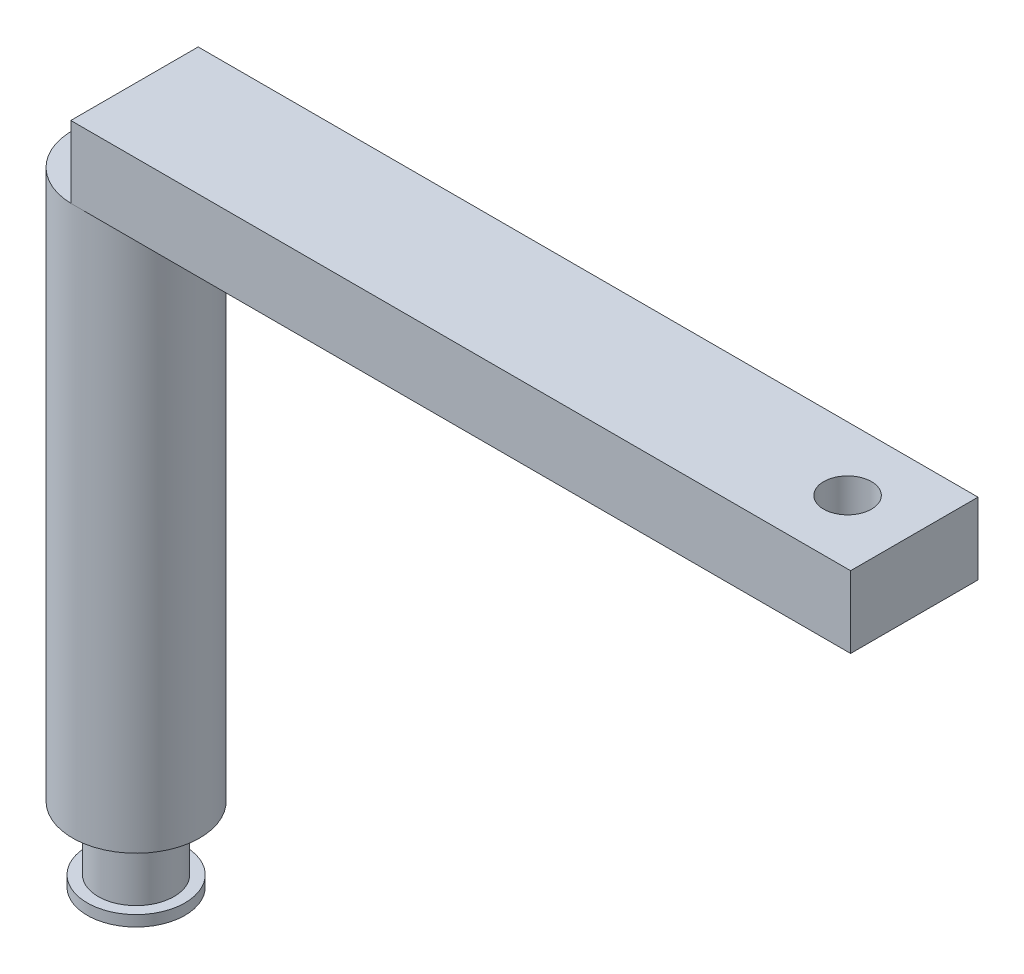
ISO-10303-21;
HEADER;
FILE_DESCRIPTION(('STEP AP214'),'2;1');
FILE_NAME('part.step','',(''),(''),'','','');
FILE_SCHEMA(('AUTOMOTIVE_DESIGN { 1 0 10303 214 1 1 1 1 }'));
ENDSEC;
DATA;
#1=APPLICATION_CONTEXT('core data for automotive mechanical design processes');
#2=APPLICATION_PROTOCOL_DEFINITION('international standard','automotive_design',2000,#1);
#3=PRODUCT_CONTEXT('',#1,'mechanical');
#4=PRODUCT('Part','Part','',(#3));
#5=PRODUCT_RELATED_PRODUCT_CATEGORY('part','',(#4));
#6=PRODUCT_DEFINITION_FORMATION('','',#4);
#7=PRODUCT_DEFINITION_CONTEXT('part definition',#1,'design');
#8=PRODUCT_DEFINITION('design','',#6,#7);
#9=PRODUCT_DEFINITION_SHAPE('','',#8);
#10=(LENGTH_UNIT() NAMED_UNIT(*) SI_UNIT(.MILLI.,.METRE.));
#11=(NAMED_UNIT(*) PLANE_ANGLE_UNIT() SI_UNIT($,.RADIAN.));
#12=(NAMED_UNIT(*) SI_UNIT($,.STERADIAN.) SOLID_ANGLE_UNIT());
#13=UNCERTAINTY_MEASURE_WITH_UNIT(LENGTH_MEASURE(1.E-05),#10,'distance_accuracy_value','');
#14=(GEOMETRIC_REPRESENTATION_CONTEXT(3) GLOBAL_UNCERTAINTY_ASSIGNED_CONTEXT((#13)) GLOBAL_UNIT_ASSIGNED_CONTEXT((#10,
#11,#12)) REPRESENTATION_CONTEXT('',''));
#15=CARTESIAN_POINT('',(0.,0.,0.));
#16=DIRECTION('',(0.,0.,1.));
#17=DIRECTION('',(1.,0.,0.));
#18=AXIS2_PLACEMENT_3D('',#15,#16,#17);
#19=CARTESIAN_POINT('',(-14.791284368385,30.2308686376491,35.0998270024249));
#20=DIRECTION('',(0.,-1.,0.));
#21=DIRECTION('',(0.,0.,-1.));
#22=AXIS2_PLACEMENT_3D('',#19,#20,#21);
#23=PLANE('',#22);
#24=DIRECTION('',(0.,0.,1.));
#25=VECTOR('',#24,1.);
#26=CARTESIAN_POINT('',(-14.7912843683849,30.2308686376491,32.4351305132776));
#27=LINE('',#26,#25);
#28=CARTESIAN_POINT('',(-14.7912843683849,30.2308686376491,32.4351305132776));
#29=VERTEX_POINT('',#28);
#30=CARTESIAN_POINT('',(-14.7912843683877,30.2308686376491,35.0998270024248));
#31=VERTEX_POINT('',#30);
#32=EDGE_CURVE('E50',#29,#31,#27,.T.);
#33=ORIENTED_EDGE('',*,*,#32,.F.);
#34=CARTESIAN_POINT('',(-14.7575347161689,30.2308686376491,33.7674787578511));
#35=DIRECTION('',(0.,-1.,0.));
#36=DIRECTION('',(0.,0.,-1.));
#37=AXIS2_PLACEMENT_3D('',#34,#35,#36);
#38=CIRCLE('',#37,1.33277563147122);
#39=EDGE_CURVE('E129',#31,#29,#38,.T.);
#40=ORIENTED_EDGE('',*,*,#39,.F.);
#41=EDGE_LOOP('',(#33,#40));
#42=FACE_BOUND('',#41,.T.);
#43=ADVANCED_FACE('F33',(#42),#23,.F.);
#44=CARTESIAN_POINT('',(-14.7776347133582,17.4184959349028,34.5609742226226));
#45=DIRECTION('',(0.,-1.,0.));
#46=DIRECTION('',(0.,0.,-1.));
#47=AXIS2_PLACEMENT_3D('',#44,#45,#46);
#48=PLANE('',#47);
#49=CARTESIAN_POINT('',(-14.7575347161689,17.4184959349028,33.7674787578511));
#50=DIRECTION('',(0.,-1.,0.));
#51=DIRECTION('',(0.,0.,-1.));
#52=AXIS2_PLACEMENT_3D('',#49,#50,#51);
#53=CIRCLE('',#52,1.02270497584844);
#54=CARTESIAN_POINT('',(-14.7575347161689,17.4184959349028,32.7447737820027));
#55=VERTEX_POINT('',#54);
#56=EDGE_CURVE('E11',#55,#55,#53,.T.);
#57=ORIENTED_EDGE('',*,*,#56,.F.);
#58=EDGE_LOOP('',(#57));
#59=FACE_BOUND('',#58,.T.);
#60=CARTESIAN_POINT('',(-14.7575347161689,17.4184959349028,33.7674787578511));
#61=DIRECTION('',(0.,-1.,0.));
#62=DIRECTION('',(0.,0.,-1.));
#63=AXIS2_PLACEMENT_3D('',#60,#61,#62);
#64=CIRCLE('',#63,0.793749999999999);
#65=CARTESIAN_POINT('',(-14.7575347161689,17.4184959349028,32.9737287578511));
#66=VERTEX_POINT('',#65);
#67=EDGE_CURVE('E105',#66,#66,#64,.T.);
#68=ORIENTED_EDGE('',*,*,#67,.T.);
#69=EDGE_LOOP('',(#68));
#70=FACE_BOUND('',#69,.T.);
#71=ADVANCED_FACE('F35',(#59,#70),#48,.F.);
#72=CARTESIAN_POINT('',(-14.7575347161689,30.3884889174142,33.7674787578511));
#73=DIRECTION('',(0.,-1.,0.));
#74=DIRECTION('',(0.,0.,-1.));
#75=AXIS2_PLACEMENT_3D('',#72,#73,#74);
#76=CYLINDRICAL_SURFACE('',#75,1.02270497584844);
#77=CARTESIAN_POINT('',(-14.7575347161689,17.1921491728471,33.7674787578511));
#78=DIRECTION('',(0.,-1.,0.));
#79=DIRECTION('',(0.,0.,-1.));
#80=AXIS2_PLACEMENT_3D('',#77,#78,#79);
#81=CIRCLE('',#80,1.02270497584844);
#82=CARTESIAN_POINT('',(-14.7575347161689,17.1921491728471,32.7447737820027));
#83=VERTEX_POINT('',#82);
#84=EDGE_CURVE('E42',#83,#83,#81,.T.);
#85=ORIENTED_EDGE('',*,*,#84,.F.);
#86=EDGE_LOOP('',(#85));
#87=FACE_BOUND('',#86,.T.);
#88=ORIENTED_EDGE('',*,*,#56,.T.);
#89=EDGE_LOOP('',(#88));
#90=FACE_BOUND('',#89,.T.);
#91=ADVANCED_FACE('F174',(#87,#90),#76,.T.);
#92=CARTESIAN_POINT('',(-14.7834325015421,17.1921491728471,34.7898557784936));
#93=DIRECTION('',(0.,1.,0.));
#94=DIRECTION('',(0.,0.,1.));
#95=AXIS2_PLACEMENT_3D('',#92,#93,#94);
#96=PLANE('',#95);
#97=ORIENTED_EDGE('',*,*,#84,.T.);
#98=EDGE_LOOP('',(#97));
#99=FACE_BOUND('',#98,.T.);
#100=ADVANCED_FACE('F159',(#99),#96,.F.);
#101=CARTESIAN_POINT('',(-14.7575347161689,30.3884889174142,33.7674787578511));
#102=DIRECTION('',(0.,-1.,0.));
#103=DIRECTION('',(0.,0.,-1.));
#104=AXIS2_PLACEMENT_3D('',#101,#102,#103);
#105=CYLINDRICAL_SURFACE('',#104,1.33277563147122);
#106=CARTESIAN_POINT('',(-14.7575347161689,18.7488274659238,33.7674787578511));
#107=DIRECTION('',(0.,-1.,0.));
#108=DIRECTION('',(0.,0.,-1.));
#109=AXIS2_PLACEMENT_3D('',#106,#107,#108);
#110=CIRCLE('',#109,1.33277563147122);
#111=CARTESIAN_POINT('',(-14.7575347161689,18.7488274659238,32.4347031263799));
#112=VERTEX_POINT('',#111);
#113=EDGE_CURVE('E126',#112,#112,#110,.T.);
#114=ORIENTED_EDGE('',*,*,#113,.F.);
#115=EDGE_LOOP('',(#114));
#116=FACE_BOUND('',#115,.T.);
#117=CARTESIAN_POINT('',(-14.7237850639437,30.2308686376491,32.4351305132776));
#118=VERTEX_POINT('',#117);
#119=CARTESIAN_POINT('',(-14.72378506395,30.2308686376491,35.0998270024248));
#120=VERTEX_POINT('',#119);
#121=EDGE_CURVE('E131',#118,#120,#38,.T.);
#122=ORIENTED_EDGE('',*,*,#121,.T.);
#123=CARTESIAN_POINT('',(-14.7912843683849,30.2308686376491,35.0998270024248));
#124=DIRECTION('',(1.,0.,0.));
#125=VECTOR('',#124,1.);
#126=LINE('',#123,#125);
#127=EDGE_CURVE('E143',#31,#120,#126,.T.);
#128=ORIENTED_EDGE('',*,*,#127,.F.);
#129=ORIENTED_EDGE('',*,*,#39,.T.);
#130=CARTESIAN_POINT('',(-14.7575347161689,30.2308686376491,33.7674787578511));
#131=DIRECTION('',(0.,-1.,0.));
#132=DIRECTION('',(-0.0253228311114061,0.,-0.999679325696247));
#133=AXIS2_PLACEMENT_3D('',#130,#131,#132);
#134=CIRCLE('',#133,1.33277563147122);
#135=EDGE_CURVE('E99',#29,#118,#134,.T.);
#136=ORIENTED_EDGE('',*,*,#135,.T.);
#137=EDGE_LOOP('',(#122,#128,#129,#136));
#138=FACE_BOUND('',#137,.T.);
#139=ADVANCED_FACE('F148',(#116,#138),#105,.T.);
#140=CARTESIAN_POINT('',(-14.791284368385,18.7488274659238,35.0998270024249));
#141=DIRECTION('',(0.,1.,0.));
#142=DIRECTION('',(0.,0.,1.));
#143=AXIS2_PLACEMENT_3D('',#140,#141,#142);
#144=PLANE('',#143);
#145=CARTESIAN_POINT('',(-14.7575347161689,18.7488274659238,33.7674787578511));
#146=DIRECTION('',(0.,-1.,0.));
#147=DIRECTION('',(0.,0.,-1.));
#148=AXIS2_PLACEMENT_3D('',#145,#146,#147);
#149=CIRCLE('',#148,0.793749999999999);
#150=CARTESIAN_POINT('',(-14.7575347161689,18.7488274659238,32.9737287578511));
#151=VERTEX_POINT('',#150);
#152=EDGE_CURVE('E108',#151,#151,#149,.T.);
#153=ORIENTED_EDGE('',*,*,#152,.F.);
#154=EDGE_LOOP('',(#153));
#155=FACE_BOUND('',#154,.T.);
#156=ORIENTED_EDGE('',*,*,#113,.T.);
#157=EDGE_LOOP('',(#156));
#158=FACE_BOUND('',#157,.T.);
#159=ADVANCED_FACE('F158',(#155,#158),#144,.F.);
#160=CARTESIAN_POINT('',(-14.7575347161689,30.3884889174142,33.7674787578511));
#161=DIRECTION('',(0.,-1.,0.));
#162=DIRECTION('',(0.,0.,-1.));
#163=AXIS2_PLACEMENT_3D('',#160,#161,#162);
#164=CYLINDRICAL_SURFACE('',#163,0.793749999999999);
#165=ORIENTED_EDGE('',*,*,#67,.F.);
#166=EDGE_LOOP('',(#165));
#167=FACE_BOUND('',#166,.T.);
#168=ORIENTED_EDGE('',*,*,#152,.T.);
#169=EDGE_LOOP('',(#168));
#170=FACE_BOUND('',#169,.T.);
#171=ADVANCED_FACE('F188',(#167,#170),#164,.T.);
#172=CARTESIAN_POINT('',(-14.7912843683849,31.7308686376491,32.4351305132776));
#173=DIRECTION('',(1.,0.,0.));
#174=DIRECTION('',(0.,0.,-1.));
#175=AXIS2_PLACEMENT_3D('',#172,#173,#174);
#176=PLANE('',#175);
#177=ORIENTED_EDGE('',*,*,#32,.T.);
#178=DIRECTION('',(0.,-1.,0.));
#179=VECTOR('',#178,1.);
#180=CARTESIAN_POINT('',(-14.7912843683849,31.7308686376491,35.0998270024248));
#181=LINE('',#180,#179);
#182=CARTESIAN_POINT('',(-14.7912843683849,31.7308686376491,35.0998270024248));
#183=VERTEX_POINT('',#182);
#184=EDGE_CURVE('E86',#183,#31,#181,.T.);
#185=ORIENTED_EDGE('',*,*,#184,.F.);
#186=DIRECTION('',(0.,0.,1.));
#187=VECTOR('',#186,1.);
#188=CARTESIAN_POINT('',(-14.7912843683849,31.7308686376491,32.4351305132776));
#189=LINE('',#188,#187);
#190=CARTESIAN_POINT('',(-14.7912843683849,31.7308686376491,32.4351305132776));
#191=VERTEX_POINT('',#190);
#192=EDGE_CURVE('E81',#191,#183,#189,.T.);
#193=ORIENTED_EDGE('',*,*,#192,.F.);
#194=DIRECTION('',(0.,-1.,0.));
#195=VECTOR('',#194,1.);
#196=CARTESIAN_POINT('',(-14.7912843683849,31.7308686376491,32.4351305132776));
#197=LINE('',#196,#195);
#198=EDGE_CURVE('E85',#191,#29,#197,.T.);
#199=ORIENTED_EDGE('',*,*,#198,.T.);
#200=EDGE_LOOP('',(#177,#185,#193,#199));
#201=FACE_BOUND('',#200,.T.);
#202=ADVANCED_FACE('F83',(#201),#176,.F.);
#203=CARTESIAN_POINT('',(-14.7237850639527,31.7308686376491,35.0998270024248));
#204=DIRECTION('',(0.,0.,-1.));
#205=DIRECTION('',(-1.,0.,0.));
#206=AXIS2_PLACEMENT_3D('',#203,#204,#205);
#207=PLANE('',#206);
#208=ORIENTED_EDGE('',*,*,#127,.T.);
#209=DIRECTION('',(1.,0.,0.));
#210=VECTOR('',#209,1.);
#211=CARTESIAN_POINT('',(-14.7237850639527,30.2308686376491,35.0998270024248));
#212=LINE('',#211,#210);
#213=CARTESIAN_POINT('',(1.52115876572623,30.2308686376491,35.0998270024248));
#214=VERTEX_POINT('',#213);
#215=EDGE_CURVE('E58',#120,#214,#212,.T.);
#216=ORIENTED_EDGE('',*,*,#215,.T.);
#217=DIRECTION('',(0.,-1.,0.));
#218=VECTOR('',#217,1.);
#219=CARTESIAN_POINT('',(1.52115876572623,31.7308686376491,35.0998270024248));
#220=LINE('',#219,#218);
#221=CARTESIAN_POINT('',(1.52115876572623,31.7308686376491,35.0998270024248));
#222=VERTEX_POINT('',#221);
#223=EDGE_CURVE('E110',#222,#214,#220,.T.);
#224=ORIENTED_EDGE('',*,*,#223,.F.);
#225=DIRECTION('',(-1.,0.,0.));
#226=VECTOR('',#225,1.);
#227=CARTESIAN_POINT('',(-14.7237850639527,31.7308686376491,35.0998270024248));
#228=LINE('',#227,#226);
#229=EDGE_CURVE('E89',#222,#183,#228,.T.);
#230=ORIENTED_EDGE('',*,*,#229,.T.);
#231=ORIENTED_EDGE('',*,*,#184,.T.);
#232=EDGE_LOOP('',(#208,#216,#224,#230,#231));
#233=FACE_BOUND('',#232,.T.);
#234=ADVANCED_FACE('F216',(#233),#207,.F.);
#235=CARTESIAN_POINT('',(1.52115876572623,31.7308686376491,35.0998270024248));
#236=DIRECTION('',(-1.,0.,0.));
#237=DIRECTION('',(0.,0.,1.));
#238=AXIS2_PLACEMENT_3D('',#235,#236,#237);
#239=PLANE('',#238);
#240=DIRECTION('',(0.,0.,-1.));
#241=VECTOR('',#240,1.);
#242=CARTESIAN_POINT('',(1.52115876572623,30.2308686376491,35.0998270024248));
#243=LINE('',#242,#241);
#244=CARTESIAN_POINT('',(1.52115876572623,30.2308686376491,32.4351305132776));
#245=VERTEX_POINT('',#244);
#246=EDGE_CURVE('E121',#214,#245,#243,.T.);
#247=ORIENTED_EDGE('',*,*,#246,.T.);
#248=DIRECTION('',(0.,-1.,0.));
#249=VECTOR('',#248,1.);
#250=CARTESIAN_POINT('',(1.52115876572623,31.7308686376491,32.4351305132776));
#251=LINE('',#250,#249);
#252=CARTESIAN_POINT('',(1.52115876572623,31.7308686376491,32.4351305132776));
#253=VERTEX_POINT('',#252);
#254=EDGE_CURVE('E197',#253,#245,#251,.T.);
#255=ORIENTED_EDGE('',*,*,#254,.F.);
#256=DIRECTION('',(0.,0.,-1.));
#257=VECTOR('',#256,1.);
#258=CARTESIAN_POINT('',(1.52115876572623,31.7308686376491,35.0998270024248));
#259=LINE('',#258,#257);
#260=EDGE_CURVE('E95',#222,#253,#259,.T.);
#261=ORIENTED_EDGE('',*,*,#260,.F.);
#262=ORIENTED_EDGE('',*,*,#223,.T.);
#263=EDGE_LOOP('',(#247,#255,#261,#262));
#264=FACE_BOUND('',#263,.T.);
#265=ADVANCED_FACE('F202',(#264),#239,.F.);
#266=CARTESIAN_POINT('',(-14.7237850639527,31.7308686376491,32.4351305132776));
#267=DIRECTION('',(0.,0.,-1.));
#268=DIRECTION('',(-1.,0.,0.));
#269=AXIS2_PLACEMENT_3D('',#266,#267,#268);
#270=PLANE('',#269);
#271=ORIENTED_EDGE('',*,*,#135,.F.);
#272=ORIENTED_EDGE('',*,*,#198,.F.);
#273=DIRECTION('',(-1.,0.,0.));
#274=VECTOR('',#273,1.);
#275=CARTESIAN_POINT('',(-14.7237850639527,31.7308686376491,32.4351305132776));
#276=LINE('',#275,#274);
#277=EDGE_CURVE('E90',#253,#191,#276,.T.);
#278=ORIENTED_EDGE('',*,*,#277,.F.);
#279=ORIENTED_EDGE('',*,*,#254,.T.);
#280=DIRECTION('',(1.,0.,0.));
#281=VECTOR('',#280,1.);
#282=CARTESIAN_POINT('',(-14.7237850639527,30.2308686376491,32.4351305132776));
#283=LINE('',#282,#281);
#284=EDGE_CURVE('E119',#118,#245,#283,.T.);
#285=ORIENTED_EDGE('',*,*,#284,.F.);
#286=EDGE_LOOP('',(#271,#272,#278,#279,#285));
#287=FACE_BOUND('',#286,.T.);
#288=ADVANCED_FACE('F101',(#287),#270,.T.);
#289=CARTESIAN_POINT('',(0.,31.7308686376491,0.));
#290=DIRECTION('',(0.,1.,0.));
#291=DIRECTION('',(0.,0.,1.));
#292=AXIS2_PLACEMENT_3D('',#289,#290,#291);
#293=PLANE('',#292);
#294=CARTESIAN_POINT('',(0.125166735427454,31.7308686376491,33.7674787578512));
#295=DIRECTION('',(0.,1.,0.));
#296=DIRECTION('',(0.,0.,1.));
#297=AXIS2_PLACEMENT_3D('',#294,#295,#296);
#298=CIRCLE('',#297,0.499999999999536);
#299=CARTESIAN_POINT('',(0.125166735427454,31.7308686376491,34.2674787578507));
#300=VERTEX_POINT('',#299);
#301=EDGE_CURVE('E331',#300,#300,#298,.T.);
#302=ORIENTED_EDGE('',*,*,#301,.F.);
#303=EDGE_LOOP('',(#302));
#304=FACE_BOUND('',#303,.T.);
#305=ORIENTED_EDGE('',*,*,#277,.T.);
#306=ORIENTED_EDGE('',*,*,#192,.T.);
#307=ORIENTED_EDGE('',*,*,#229,.F.);
#308=ORIENTED_EDGE('',*,*,#260,.T.);
#309=EDGE_LOOP('',(#305,#306,#307,#308));
#310=FACE_BOUND('',#309,.T.);
#311=ADVANCED_FACE('F93',(#304,#310),#293,.T.);
#312=CARTESIAN_POINT('',(0.,30.2308686376491,0.));
#313=DIRECTION('',(0.,1.,0.));
#314=DIRECTION('',(0.,0.,1.));
#315=AXIS2_PLACEMENT_3D('',#312,#313,#314);
#316=PLANE('',#315);
#317=CARTESIAN_POINT('',(0.125166735427454,30.2308686376491,33.7674787578512));
#318=DIRECTION('',(0.,1.,0.));
#319=DIRECTION('',(0.,0.,1.));
#320=AXIS2_PLACEMENT_3D('',#317,#318,#319);
#321=CIRCLE('',#320,0.499999999999536);
#322=CARTESIAN_POINT('',(0.125166735427454,30.2308686376491,34.2674787578507));
#323=VERTEX_POINT('',#322);
#324=EDGE_CURVE('E37',#323,#323,#321,.T.);
#325=ORIENTED_EDGE('',*,*,#324,.T.);
#326=EDGE_LOOP('',(#325));
#327=FACE_BOUND('',#326,.T.);
#328=ORIENTED_EDGE('',*,*,#121,.F.);
#329=ORIENTED_EDGE('',*,*,#284,.T.);
#330=ORIENTED_EDGE('',*,*,#246,.F.);
#331=ORIENTED_EDGE('',*,*,#215,.F.);
#332=EDGE_LOOP('',(#328,#329,#330,#331));
#333=FACE_BOUND('',#332,.T.);
#334=ADVANCED_FACE('F196',(#327,#333),#316,.F.);
#335=CARTESIAN_POINT('',(0.125166735427454,31.7308936376491,33.7674787578512));
#336=DIRECTION('',(0.,-1.,0.));
#337=DIRECTION('',(0.,0.,-1.));
#338=AXIS2_PLACEMENT_3D('',#335,#336,#337);
#339=CYLINDRICAL_SURFACE('',#338,0.499999999999536);
#340=ORIENTED_EDGE('',*,*,#301,.T.);
#341=EDGE_LOOP('',(#340));
#342=FACE_BOUND('',#341,.T.);
#343=ORIENTED_EDGE('',*,*,#324,.F.);
#344=EDGE_LOOP('',(#343));
#345=FACE_BOUND('',#344,.T.);
#346=ADVANCED_FACE('F259',(#342,#345),#339,.F.);
#347=CLOSED_SHELL('',(#43,#71,#91,#100,#139,#159,#171,#202,#234,#265,#288,#311,#334,#346));
#348=MANIFOLD_SOLID_BREP('B2',#347);
#349=ADVANCED_BREP_SHAPE_REPRESENTATION('',(#18,#348),#14);
#350=SHAPE_DEFINITION_REPRESENTATION(#9,#349);
ENDSEC;
END-ISO-10303-21;
